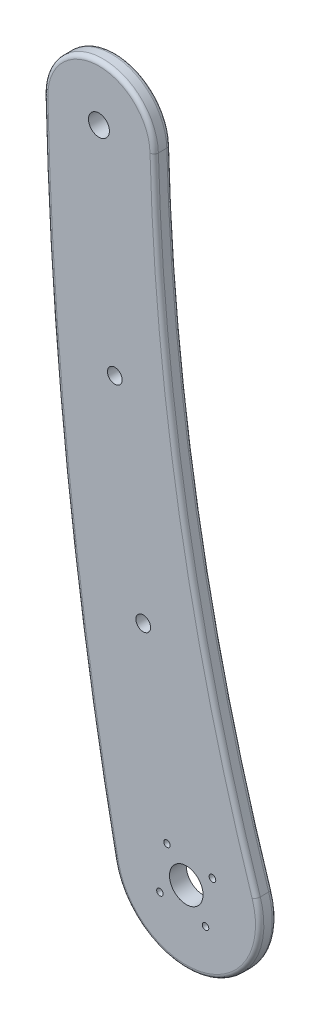
ISO-10303-21;
HEADER;
FILE_DESCRIPTION(('STEP AP214'),'2;1');
FILE_NAME('part.step','',(''),(''),'','','');
FILE_SCHEMA(('AUTOMOTIVE_DESIGN { 1 0 10303 214 1 1 1 1 }'));
ENDSEC;
DATA;
#1=APPLICATION_CONTEXT('core data for automotive mechanical design processes');
#2=APPLICATION_PROTOCOL_DEFINITION('international standard','automotive_design',2000,#1);
#3=PRODUCT_CONTEXT('',#1,'mechanical');
#4=PRODUCT('Part','Part','',(#3));
#5=PRODUCT_RELATED_PRODUCT_CATEGORY('part','',(#4));
#6=PRODUCT_DEFINITION_FORMATION('','',#4);
#7=PRODUCT_DEFINITION_CONTEXT('part definition',#1,'design');
#8=PRODUCT_DEFINITION('design','',#6,#7);
#9=PRODUCT_DEFINITION_SHAPE('','',#8);
#10=(LENGTH_UNIT() NAMED_UNIT(*) SI_UNIT(.MILLI.,.METRE.));
#11=(NAMED_UNIT(*) PLANE_ANGLE_UNIT() SI_UNIT($,.RADIAN.));
#12=(NAMED_UNIT(*) SI_UNIT($,.STERADIAN.) SOLID_ANGLE_UNIT());
#13=UNCERTAINTY_MEASURE_WITH_UNIT(LENGTH_MEASURE(1.E-05),#10,'distance_accuracy_value','');
#14=(GEOMETRIC_REPRESENTATION_CONTEXT(3) GLOBAL_UNCERTAINTY_ASSIGNED_CONTEXT((#13)) GLOBAL_UNIT_ASSIGNED_CONTEXT((#10,
#11,#12)) REPRESENTATION_CONTEXT('',''));
#15=CARTESIAN_POINT('',(0.,0.,0.));
#16=DIRECTION('',(0.,0.,1.));
#17=DIRECTION('',(1.,0.,0.));
#18=AXIS2_PLACEMENT_3D('',#15,#16,#17);
#19=CARTESIAN_POINT('',(795.529964386181,224.037291756772,2.));
#20=DIRECTION('',(0.,0.,-1.));
#21=DIRECTION('',(-1.,0.,0.));
#22=AXIS2_PLACEMENT_3D('',#19,#20,#21);
#23=CYLINDRICAL_SURFACE('',#22,850.);
#24=DIRECTION('',(0.,0.,-1.));
#25=VECTOR('',#24,1.);
#26=CARTESIAN_POINT('',(-54.2361172491982,204.097218987227,2.));
#27=LINE('',#26,#25);
#28=CARTESIAN_POINT('',(-54.2361172491982,204.097218987227,1.));
#29=VERTEX_POINT('',#28);
#30=CARTESIAN_POINT('',(-54.2361172491982,204.097218987227,-1.));
#31=VERTEX_POINT('',#30);
#32=EDGE_CURVE('E267',#29,#31,#27,.T.);
#33=ORIENTED_EDGE('',*,*,#32,.T.);
#34=CARTESIAN_POINT('',(795.529964386181,224.037291756772,-1.));
#35=DIRECTION('',(0.,0.,1.));
#36=DIRECTION('',(1.,0.,0.));
#37=AXIS2_PLACEMENT_3D('',#34,#35,#36);
#38=CIRCLE('',#37,850.);
#39=CARTESIAN_POINT('',(-37.367897149259,54.3872040771849,-1.));
#40=VERTEX_POINT('',#39);
#41=EDGE_CURVE('E140',#31,#40,#38,.T.);
#42=ORIENTED_EDGE('',*,*,#41,.T.);
#43=DIRECTION('',(0.,0.,-1.));
#44=VECTOR('',#43,1.);
#45=CARTESIAN_POINT('',(-37.367897149259,54.3872040771849,2.));
#46=LINE('',#45,#44);
#47=CARTESIAN_POINT('',(-37.367897149259,54.3872040771849,1.));
#48=VERTEX_POINT('',#47);
#49=EDGE_CURVE('E123',#48,#40,#46,.T.);
#50=ORIENTED_EDGE('',*,*,#49,.F.);
#51=CARTESIAN_POINT('',(795.529964386181,224.037291756772,1.));
#52=DIRECTION('',(0.,0.,1.));
#53=DIRECTION('',(1.,0.,0.));
#54=AXIS2_PLACEMENT_3D('',#51,#52,#53);
#55=CIRCLE('',#54,850.);
#56=EDGE_CURVE('E138',#48,#29,#55,.F.);
#57=ORIENTED_EDGE('',*,*,#56,.T.);
#58=EDGE_LOOP('',(#33,#42,#50,#57));
#59=FACE_BOUND('',#58,.T.);
#60=ADVANCED_FACE('F34',(#59),#23,.T.);
#61=CARTESIAN_POINT('',(-20.22,57.8800000000001,2.));
#62=DIRECTION('',(0.,0.,-1.));
#63=DIRECTION('',(-1.,0.,0.));
#64=AXIS2_PLACEMENT_3D('',#61,#62,#63);
#65=CYLINDRICAL_SURFACE('',#64,17.5);
#66=ORIENTED_EDGE('',*,*,#49,.T.);
#67=CARTESIAN_POINT('',(-20.22,57.8800000000001,-1.));
#68=DIRECTION('',(0.,0.,1.));
#69=DIRECTION('',(1.,0.,0.));
#70=AXIS2_PLACEMENT_3D('',#67,#68,#69);
#71=CIRCLE('',#70,17.5);
#72=CARTESIAN_POINT('',(-3.57614065730799,63.2866575793815,-1.));
#73=VERTEX_POINT('',#72);
#74=EDGE_CURVE('E144',#40,#73,#71,.T.);
#75=ORIENTED_EDGE('',*,*,#74,.T.);
#76=DIRECTION('',(0.,0.,-1.));
#77=VECTOR('',#76,1.);
#78=CARTESIAN_POINT('',(-3.57614065730799,63.2866575793815,2.));
#79=LINE('',#78,#77);
#80=CARTESIAN_POINT('',(-3.57614065730799,63.2866575793815,1.));
#81=VERTEX_POINT('',#80);
#82=EDGE_CURVE('E268',#81,#73,#79,.T.);
#83=ORIENTED_EDGE('',*,*,#82,.F.);
#84=CARTESIAN_POINT('',(-20.22,57.8800000000001,1.));
#85=DIRECTION('',(0.,0.,1.));
#86=DIRECTION('',(1.,0.,0.));
#87=AXIS2_PLACEMENT_3D('',#84,#85,#86);
#88=CIRCLE('',#87,17.5);
#89=EDGE_CURVE('E142',#81,#48,#88,.F.);
#90=ORIENTED_EDGE('',*,*,#89,.T.);
#91=EDGE_LOOP('',(#66,#75,#83,#90));
#92=FACE_BOUND('',#91,.T.);
#93=ADVANCED_FACE('F195',(#92),#65,.T.);
#94=CARTESIAN_POINT('',(471.962697705322,217.76258841885,2.));
#95=DIRECTION('',(0.,0.,-1.));
#96=DIRECTION('',(-1.,0.,0.));
#97=AXIS2_PLACEMENT_3D('',#94,#95,#96);
#98=CYLINDRICAL_SURFACE('',#97,500.);
#99=ORIENTED_EDGE('',*,*,#82,.T.);
#100=CARTESIAN_POINT('',(471.962697705322,217.76258841885,-1.));
#101=DIRECTION('',(0.,0.,1.));
#102=DIRECTION('',(1.,0.,0.));
#103=AXIS2_PLACEMENT_3D('',#100,#101,#102);
#104=CIRCLE('',#103,500.);
#105=CARTESIAN_POINT('',(-27.8679416368813,204.749826422866,-1.));
#106=VERTEX_POINT('',#105);
#107=EDGE_CURVE('E11',#73,#106,#104,.F.);
#108=ORIENTED_EDGE('',*,*,#107,.T.);
#109=DIRECTION('',(0.,0.,-1.));
#110=VECTOR('',#109,1.);
#111=CARTESIAN_POINT('',(-27.8679416368813,204.749826422866,2.));
#112=LINE('',#111,#110);
#113=CARTESIAN_POINT('',(-27.8679416368813,204.749826422866,1.));
#114=VERTEX_POINT('',#113);
#115=EDGE_CURVE('E266',#114,#106,#112,.T.);
#116=ORIENTED_EDGE('',*,*,#115,.F.);
#117=CARTESIAN_POINT('',(471.962697705322,217.76258841885,1.));
#118=DIRECTION('',(0.,0.,1.));
#119=DIRECTION('',(1.,0.,0.));
#120=AXIS2_PLACEMENT_3D('',#117,#118,#119);
#121=CIRCLE('',#120,500.);
#122=EDGE_CURVE('E43',#114,#81,#121,.T.);
#123=ORIENTED_EDGE('',*,*,#122,.T.);
#124=EDGE_LOOP('',(#99,#108,#116,#123));
#125=FACE_BOUND('',#124,.T.);
#126=ADVANCED_FACE('F201',(#125),#98,.F.);
#127=CARTESIAN_POINT('',(-20.22,57.88,2.));
#128=DIRECTION('',(0.,0.,-1.));
#129=DIRECTION('',(-1.,0.,0.));
#130=AXIS2_PLACEMENT_3D('',#127,#128,#129);
#131=CYLINDRICAL_SURFACE('',#130,4.);
#132=CARTESIAN_POINT('',(-20.22,57.88,2.));
#133=DIRECTION('',(0.,0.,1.));
#134=DIRECTION('',(1.,0.,0.));
#135=AXIS2_PLACEMENT_3D('',#132,#133,#134);
#136=CIRCLE('',#135,4.);
#137=CARTESIAN_POINT('',(-16.22,57.88,2.));
#138=VERTEX_POINT('',#137);
#139=EDGE_CURVE('E271',#138,#138,#136,.T.);
#140=ORIENTED_EDGE('',*,*,#139,.T.);
#141=EDGE_LOOP('',(#140));
#142=FACE_BOUND('',#141,.T.);
#143=CARTESIAN_POINT('',(-20.22,57.88,-2.));
#144=DIRECTION('',(0.,0.,1.));
#145=DIRECTION('',(1.,0.,0.));
#146=AXIS2_PLACEMENT_3D('',#143,#144,#145);
#147=CIRCLE('',#146,4.);
#148=CARTESIAN_POINT('',(-16.22,57.88,-2.));
#149=VERTEX_POINT('',#148);
#150=EDGE_CURVE('E280',#149,#149,#147,.T.);
#151=ORIENTED_EDGE('',*,*,#150,.F.);
#152=EDGE_LOOP('',(#151));
#153=FACE_BOUND('',#152,.T.);
#154=ADVANCED_FACE('F207',(#142,#153),#131,.F.);
#155=CARTESIAN_POINT('',(-30.482103358654,106.815562065397,2.));
#156=DIRECTION('',(0.,0.,-1.));
#157=DIRECTION('',(-1.,0.,0.));
#158=AXIS2_PLACEMENT_3D('',#155,#156,#157);
#159=CYLINDRICAL_SURFACE('',#158,1.75);
#160=CARTESIAN_POINT('',(-30.482103358654,106.815562065397,2.));
#161=DIRECTION('',(0.,0.,1.));
#162=DIRECTION('',(1.,0.,0.));
#163=AXIS2_PLACEMENT_3D('',#160,#161,#162);
#164=CIRCLE('',#163,1.75);
#165=CARTESIAN_POINT('',(-28.732103358654,106.815562065397,2.));
#166=VERTEX_POINT('',#165);
#167=EDGE_CURVE('E294',#166,#166,#164,.T.);
#168=ORIENTED_EDGE('',*,*,#167,.T.);
#169=EDGE_LOOP('',(#168));
#170=FACE_BOUND('',#169,.T.);
#171=CARTESIAN_POINT('',(-30.482103358654,106.815562065397,-2.));
#172=DIRECTION('',(0.,0.,1.));
#173=DIRECTION('',(1.,0.,0.));
#174=AXIS2_PLACEMENT_3D('',#171,#172,#173);
#175=CIRCLE('',#174,1.75);
#176=CARTESIAN_POINT('',(-28.732103358654,106.815562065397,-2.));
#177=VERTEX_POINT('',#176);
#178=EDGE_CURVE('E284',#177,#177,#175,.T.);
#179=ORIENTED_EDGE('',*,*,#178,.F.);
#180=EDGE_LOOP('',(#179));
#181=FACE_BOUND('',#180,.T.);
#182=ADVANCED_FACE('F210',(#170,#181),#159,.F.);
#183=CARTESIAN_POINT('',(-41.0516105664775,204.406598272145,2.));
#184=DIRECTION('',(0.,0.,-1.));
#185=DIRECTION('',(-1.,0.,0.));
#186=AXIS2_PLACEMENT_3D('',#183,#184,#185);
#187=CYLINDRICAL_SURFACE('',#186,2.5);
#188=CARTESIAN_POINT('',(-41.0516105664775,204.406598272145,2.));
#189=DIRECTION('',(0.,0.,1.));
#190=DIRECTION('',(1.,0.,0.));
#191=AXIS2_PLACEMENT_3D('',#188,#189,#190);
#192=CIRCLE('',#191,2.5);
#193=CARTESIAN_POINT('',(-38.5516105664775,204.406598272145,2.));
#194=VERTEX_POINT('',#193);
#195=EDGE_CURVE('E297',#194,#194,#192,.T.);
#196=ORIENTED_EDGE('',*,*,#195,.T.);
#197=EDGE_LOOP('',(#196));
#198=FACE_BOUND('',#197,.T.);
#199=CARTESIAN_POINT('',(-41.0516105664775,204.406598272145,-2.));
#200=DIRECTION('',(0.,0.,1.));
#201=DIRECTION('',(1.,0.,0.));
#202=AXIS2_PLACEMENT_3D('',#199,#200,#201);
#203=CIRCLE('',#202,2.5);
#204=CARTESIAN_POINT('',(-38.5516105664775,204.406598272145,-2.));
#205=VERTEX_POINT('',#204);
#206=EDGE_CURVE('E287',#205,#205,#203,.T.);
#207=ORIENTED_EDGE('',*,*,#206,.F.);
#208=EDGE_LOOP('',(#207));
#209=FACE_BOUND('',#208,.T.);
#210=ADVANCED_FACE('F214',(#198,#209),#187,.F.);
#211=CARTESIAN_POINT('',(-37.2684730070745,154.549924995575,2.));
#212=DIRECTION('',(0.,0.,-1.));
#213=DIRECTION('',(-1.,0.,0.));
#214=AXIS2_PLACEMENT_3D('',#211,#212,#213);
#215=CYLINDRICAL_SURFACE('',#214,1.75);
#216=CARTESIAN_POINT('',(-37.2684730070745,154.549924995575,2.));
#217=DIRECTION('',(0.,0.,1.));
#218=DIRECTION('',(1.,0.,0.));
#219=AXIS2_PLACEMENT_3D('',#216,#217,#218);
#220=CIRCLE('',#219,1.75);
#221=CARTESIAN_POINT('',(-35.5184730070745,154.549924995575,2.));
#222=VERTEX_POINT('',#221);
#223=EDGE_CURVE('E283',#222,#222,#220,.T.);
#224=ORIENTED_EDGE('',*,*,#223,.T.);
#225=EDGE_LOOP('',(#224));
#226=FACE_BOUND('',#225,.T.);
#227=CARTESIAN_POINT('',(-37.2684730070745,154.549924995575,-2.));
#228=DIRECTION('',(0.,0.,1.));
#229=DIRECTION('',(1.,0.,0.));
#230=AXIS2_PLACEMENT_3D('',#227,#228,#229);
#231=CIRCLE('',#230,1.75);
#232=CARTESIAN_POINT('',(-35.5184730070745,154.549924995575,-2.));
#233=VERTEX_POINT('',#232);
#234=EDGE_CURVE('E159',#233,#233,#231,.T.);
#235=ORIENTED_EDGE('',*,*,#234,.F.);
#236=EDGE_LOOP('',(#235));
#237=FACE_BOUND('',#236,.T.);
#238=ADVANCED_FACE('F218',(#226,#237),#215,.F.);
#239=CARTESIAN_POINT('',(-41.0516105664774,204.406598272145,2.));
#240=DIRECTION('',(0.,0.,-1.));
#241=DIRECTION('',(-1.,0.,0.));
#242=AXIS2_PLACEMENT_3D('',#239,#240,#241);
#243=CYLINDRICAL_SURFACE('',#242,13.1881360323832);
#244=ORIENTED_EDGE('',*,*,#115,.T.);
#245=CARTESIAN_POINT('',(-41.0516105664774,204.406598272145,-1.));
#246=DIRECTION('',(0.,0.,1.));
#247=DIRECTION('',(1.,0.,0.));
#248=AXIS2_PLACEMENT_3D('',#245,#246,#247);
#249=CIRCLE('',#248,13.1881360323832);
#250=EDGE_CURVE('E109',#106,#31,#249,.T.);
#251=ORIENTED_EDGE('',*,*,#250,.T.);
#252=ORIENTED_EDGE('',*,*,#32,.F.);
#253=CARTESIAN_POINT('',(-41.0516105664774,204.406598272145,1.));
#254=DIRECTION('',(0.,0.,1.));
#255=DIRECTION('',(1.,0.,0.));
#256=AXIS2_PLACEMENT_3D('',#253,#254,#255);
#257=CIRCLE('',#256,13.1881360323832);
#258=EDGE_CURVE('E130',#29,#114,#257,.F.);
#259=ORIENTED_EDGE('',*,*,#258,.T.);
#260=EDGE_LOOP('',(#244,#251,#252,#259));
#261=FACE_BOUND('',#260,.T.);
#262=ADVANCED_FACE('F222',(#261),#243,.T.);
#263=CARTESIAN_POINT('',(0.,0.,2.));
#264=DIRECTION('',(0.,0.,1.));
#265=DIRECTION('',(1.,0.,0.));
#266=AXIS2_PLACEMENT_3D('',#263,#264,#265);
#267=PLANE('',#266);
#268=CARTESIAN_POINT('',(-24.8144808396243,64.1519324898418,2.));
#269=DIRECTION('',(0.,0.,-1.));
#270=DIRECTION('',(-1.,0.,0.));
#271=AXIS2_PLACEMENT_3D('',#268,#269,#270);
#272=CIRCLE('',#271,0.767868533244551);
#273=CARTESIAN_POINT('',(-25.5823493728689,64.1519324898418,2.));
#274=VERTEX_POINT('',#273);
#275=EDGE_CURVE('E172',#274,#274,#272,.T.);
#276=ORIENTED_EDGE('',*,*,#275,.T.);
#277=EDGE_LOOP('',(#276));
#278=FACE_BOUND('',#277,.T.);
#279=CARTESIAN_POINT('',(-26.5151891655994,53.2992564984726,2.));
#280=DIRECTION('',(0.,0.,-1.));
#281=DIRECTION('',(-1.,0.,0.));
#282=AXIS2_PLACEMENT_3D('',#279,#280,#281);
#283=CIRCLE('',#282,0.771761199024674);
#284=CARTESIAN_POINT('',(-27.2869503646241,53.2992564984726,2.));
#285=VERTEX_POINT('',#284);
#286=EDGE_CURVE('E308',#285,#285,#283,.T.);
#287=ORIENTED_EDGE('',*,*,#286,.T.);
#288=EDGE_LOOP('',(#287));
#289=FACE_BOUND('',#288,.T.);
#290=CARTESIAN_POINT('',(-15.627794634822,51.6358969960497,2.));
#291=DIRECTION('',(0.,0.,-1.));
#292=DIRECTION('',(-1.,0.,0.));
#293=AXIS2_PLACEMENT_3D('',#290,#291,#292);
#294=CIRCLE('',#293,0.768034617716511);
#295=CARTESIAN_POINT('',(-16.3958292525385,51.6358969960497,2.));
#296=VERTEX_POINT('',#295);
#297=EDGE_CURVE('E305',#296,#296,#294,.T.);
#298=ORIENTED_EDGE('',*,*,#297,.T.);
#299=EDGE_LOOP('',(#298));
#300=FACE_BOUND('',#299,.T.);
#301=CARTESIAN_POINT('',(-13.9848420209366,62.4261721582919,2.));
#302=DIRECTION('',(0.,0.,-1.));
#303=DIRECTION('',(-1.,0.,0.));
#304=AXIS2_PLACEMENT_3D('',#301,#302,#303);
#305=CIRCLE('',#304,0.795284138011949);
#306=CARTESIAN_POINT('',(-14.7801261589485,62.4261721582919,2.));
#307=VERTEX_POINT('',#306);
#308=EDGE_CURVE('E302',#307,#307,#305,.T.);
#309=ORIENTED_EDGE('',*,*,#308,.T.);
#310=EDGE_LOOP('',(#309));
#311=FACE_BOUND('',#310,.T.);
#312=CARTESIAN_POINT('',(471.962697705322,217.76258841885,2.));
#313=DIRECTION('',(0.,0.,1.));
#314=DIRECTION('',(1.,0.,0.));
#315=AXIS2_PLACEMENT_3D('',#312,#313,#314);
#316=CIRCLE('',#315,501.);
#317=CARTESIAN_POINT('',(-4.52721833403318,62.9777057177026,2.));
#318=VERTEX_POINT('',#317);
#319=CARTESIAN_POINT('',(-28.8676029155657,204.723800898874,2.));
#320=VERTEX_POINT('',#319);
#321=EDGE_CURVE('E146',#318,#320,#316,.F.);
#322=ORIENTED_EDGE('',*,*,#321,.T.);
#323=CARTESIAN_POINT('',(-41.0516105664774,204.406598272145,2.));
#324=DIRECTION('',(0.,0.,1.));
#325=DIRECTION('',(1.,0.,0.));
#326=AXIS2_PLACEMENT_3D('',#323,#324,#325);
#327=CIRCLE('',#326,12.1881360323832);
#328=CARTESIAN_POINT('',(-53.2363924472743,204.120677896368,2.));
#329=VERTEX_POINT('',#328);
#330=EDGE_CURVE('E151',#320,#329,#327,.T.);
#331=ORIENTED_EDGE('',*,*,#330,.T.);
#332=CARTESIAN_POINT('',(795.529964386181,224.037291756772,2.));
#333=DIRECTION('',(0.,0.,1.));
#334=DIRECTION('',(1.,0.,0.));
#335=AXIS2_PLACEMENT_3D('',#332,#333,#334);
#336=CIRCLE('',#335,849.);
#337=CARTESIAN_POINT('',(-36.3880173121585,54.5867924156315,2.));
#338=VERTEX_POINT('',#337);
#339=EDGE_CURVE('E58',#329,#338,#336,.T.);
#340=ORIENTED_EDGE('',*,*,#339,.T.);
#341=CARTESIAN_POINT('',(-20.22,57.8800000000001,2.));
#342=DIRECTION('',(0.,0.,1.));
#343=DIRECTION('',(1.,0.,0.));
#344=AXIS2_PLACEMENT_3D('',#341,#342,#343);
#345=CIRCLE('',#344,16.5);
#346=EDGE_CURVE('E148',#338,#318,#345,.T.);
#347=ORIENTED_EDGE('',*,*,#346,.T.);
#348=EDGE_LOOP('',(#322,#331,#340,#347));
#349=FACE_BOUND('',#348,.T.);
#350=ORIENTED_EDGE('',*,*,#223,.F.);
#351=EDGE_LOOP('',(#350));
#352=FACE_BOUND('',#351,.T.);
#353=ORIENTED_EDGE('',*,*,#195,.F.);
#354=EDGE_LOOP('',(#353));
#355=FACE_BOUND('',#354,.T.);
#356=ORIENTED_EDGE('',*,*,#167,.F.);
#357=EDGE_LOOP('',(#356));
#358=FACE_BOUND('',#357,.T.);
#359=ORIENTED_EDGE('',*,*,#139,.F.);
#360=EDGE_LOOP('',(#359));
#361=FACE_BOUND('',#360,.T.);
#362=ADVANCED_FACE('F255',(#278,#289,#300,#311,#349,#352,#355,#358,#361),#267,.T.);
#363=CARTESIAN_POINT('',(0.,0.,-2.));
#364=DIRECTION('',(0.,0.,1.));
#365=DIRECTION('',(1.,0.,0.));
#366=AXIS2_PLACEMENT_3D('',#363,#364,#365);
#367=PLANE('',#366);
#368=CARTESIAN_POINT('',(-24.8144808396243,64.1519324898418,-2.));
#369=DIRECTION('',(0.,0.,1.));
#370=DIRECTION('',(1.,0.,0.));
#371=AXIS2_PLACEMENT_3D('',#368,#369,#370);
#372=CIRCLE('',#371,0.767868533244551);
#373=CARTESIAN_POINT('',(-24.0466123063798,64.1519324898418,-2.));
#374=VERTEX_POINT('',#373);
#375=EDGE_CURVE('E38',#374,#374,#372,.T.);
#376=ORIENTED_EDGE('',*,*,#375,.T.);
#377=EDGE_LOOP('',(#376));
#378=FACE_BOUND('',#377,.T.);
#379=CARTESIAN_POINT('',(-26.5151891655994,53.2992564984726,-2.));
#380=DIRECTION('',(0.,0.,1.));
#381=DIRECTION('',(1.,0.,0.));
#382=AXIS2_PLACEMENT_3D('',#379,#380,#381);
#383=CIRCLE('',#382,0.771761199024674);
#384=CARTESIAN_POINT('',(-25.7434279665748,53.2992564984726,-2.));
#385=VERTEX_POINT('',#384);
#386=EDGE_CURVE('E174',#385,#385,#383,.T.);
#387=ORIENTED_EDGE('',*,*,#386,.T.);
#388=EDGE_LOOP('',(#387));
#389=FACE_BOUND('',#388,.T.);
#390=CARTESIAN_POINT('',(-15.627794634822,51.6358969960497,-2.));
#391=DIRECTION('',(0.,0.,1.));
#392=DIRECTION('',(1.,0.,0.));
#393=AXIS2_PLACEMENT_3D('',#390,#391,#392);
#394=CIRCLE('',#393,0.768034617716511);
#395=CARTESIAN_POINT('',(-14.8597600171054,51.6358969960497,-2.));
#396=VERTEX_POINT('',#395);
#397=EDGE_CURVE('E171',#396,#396,#394,.T.);
#398=ORIENTED_EDGE('',*,*,#397,.T.);
#399=EDGE_LOOP('',(#398));
#400=FACE_BOUND('',#399,.T.);
#401=CARTESIAN_POINT('',(-13.9848420209366,62.4261721582919,-2.));
#402=DIRECTION('',(0.,0.,1.));
#403=DIRECTION('',(1.,0.,0.));
#404=AXIS2_PLACEMENT_3D('',#401,#402,#403);
#405=CIRCLE('',#404,0.795284138011949);
#406=CARTESIAN_POINT('',(-13.1895578829246,62.4261721582919,-2.));
#407=VERTEX_POINT('',#406);
#408=EDGE_CURVE('E168',#407,#407,#405,.T.);
#409=ORIENTED_EDGE('',*,*,#408,.T.);
#410=EDGE_LOOP('',(#409));
#411=FACE_BOUND('',#410,.T.);
#412=CARTESIAN_POINT('',(795.529964386181,224.037291756772,-2.));
#413=DIRECTION('',(0.,0.,1.));
#414=DIRECTION('',(1.,0.,0.));
#415=AXIS2_PLACEMENT_3D('',#412,#413,#414);
#416=CIRCLE('',#415,849.);
#417=CARTESIAN_POINT('',(-36.3880173121585,54.5867924156315,-2.));
#418=VERTEX_POINT('',#417);
#419=CARTESIAN_POINT('',(-53.2363924472743,204.120677896368,-2.));
#420=VERTEX_POINT('',#419);
#421=EDGE_CURVE('E128',#418,#420,#416,.F.);
#422=ORIENTED_EDGE('',*,*,#421,.T.);
#423=CARTESIAN_POINT('',(-41.0516105664774,204.406598272145,-2.));
#424=DIRECTION('',(0.,0.,1.));
#425=DIRECTION('',(1.,0.,0.));
#426=AXIS2_PLACEMENT_3D('',#423,#424,#425);
#427=CIRCLE('',#426,12.1881360323832);
#428=CARTESIAN_POINT('',(-28.8676029155657,204.723800898874,-2.));
#429=VERTEX_POINT('',#428);
#430=EDGE_CURVE('E107',#420,#429,#427,.F.);
#431=ORIENTED_EDGE('',*,*,#430,.T.);
#432=CARTESIAN_POINT('',(471.962697705322,217.76258841885,-2.));
#433=DIRECTION('',(0.,0.,1.));
#434=DIRECTION('',(1.,0.,0.));
#435=AXIS2_PLACEMENT_3D('',#432,#433,#434);
#436=CIRCLE('',#435,501.);
#437=CARTESIAN_POINT('',(-4.52721833403318,62.9777057177026,-2.));
#438=VERTEX_POINT('',#437);
#439=EDGE_CURVE('E116',#429,#438,#436,.T.);
#440=ORIENTED_EDGE('',*,*,#439,.T.);
#441=CARTESIAN_POINT('',(-20.22,57.8800000000001,-2.));
#442=DIRECTION('',(0.,0.,1.));
#443=DIRECTION('',(1.,0.,0.));
#444=AXIS2_PLACEMENT_3D('',#441,#442,#443);
#445=CIRCLE('',#444,16.5);
#446=EDGE_CURVE('E122',#438,#418,#445,.F.);
#447=ORIENTED_EDGE('',*,*,#446,.T.);
#448=EDGE_LOOP('',(#422,#431,#440,#447));
#449=FACE_BOUND('',#448,.T.);
#450=ORIENTED_EDGE('',*,*,#234,.T.);
#451=EDGE_LOOP('',(#450));
#452=FACE_BOUND('',#451,.T.);
#453=ORIENTED_EDGE('',*,*,#206,.T.);
#454=EDGE_LOOP('',(#453));
#455=FACE_BOUND('',#454,.T.);
#456=ORIENTED_EDGE('',*,*,#178,.T.);
#457=EDGE_LOOP('',(#456));
#458=FACE_BOUND('',#457,.T.);
#459=ORIENTED_EDGE('',*,*,#150,.T.);
#460=EDGE_LOOP('',(#459));
#461=FACE_BOUND('',#460,.T.);
#462=ADVANCED_FACE('F125',(#378,#389,#400,#411,#449,#452,#455,#458,#461),#367,.F.);
#463=CARTESIAN_POINT('',(-20.22,57.8800000000001,-1.));
#464=DIRECTION('',(0.,0.,1.));
#465=DIRECTION('',(1.,0.,0.));
#466=AXIS2_PLACEMENT_3D('',#463,#464,#465);
#467=TOROIDAL_SURFACE('',#466,16.5,1.);
#468=CARTESIAN_POINT('',(-4.52721833403318,62.9777057177026,-1.));
#469=DIRECTION('',(-0.308951861678939,0.95107767672526,0.));
#470=DIRECTION('',(-0.95107767672526,-0.308951861678939,0.));
#471=AXIS2_PLACEMENT_3D('',#468,#469,#470);
#472=CIRCLE('',#471,1.);
#473=EDGE_CURVE('E119',#73,#438,#472,.T.);
#474=ORIENTED_EDGE('',*,*,#473,.F.);
#475=ORIENTED_EDGE('',*,*,#74,.F.);
#476=CARTESIAN_POINT('',(-36.3880173121585,54.5867924156315,-1.));
#477=DIRECTION('',(-0.199588338446577,0.979879837100517,0.));
#478=DIRECTION('',(-0.979879837100517,-0.199588338446577,0.));
#479=AXIS2_PLACEMENT_3D('',#476,#477,#478);
#480=CIRCLE('',#479,1.);
#481=EDGE_CURVE('E156',#418,#40,#480,.T.);
#482=ORIENTED_EDGE('',*,*,#481,.F.);
#483=ORIENTED_EDGE('',*,*,#446,.F.);
#484=EDGE_LOOP('',(#474,#475,#482,#483));
#485=FACE_BOUND('',#484,.T.);
#486=ADVANCED_FACE('F231',(#485),#467,.T.);
#487=CARTESIAN_POINT('',(795.529964386181,224.037291756772,-1.));
#488=DIRECTION('',(0.,0.,1.));
#489=DIRECTION('',(1.,0.,0.));
#490=AXIS2_PLACEMENT_3D('',#487,#488,#489);
#491=TOROIDAL_SURFACE('',#490,849.,1.);
#492=ORIENTED_EDGE('',*,*,#481,.T.);
#493=ORIENTED_EDGE('',*,*,#41,.F.);
#494=CARTESIAN_POINT('',(-53.2363924472743,204.120677896368,-1.));
#495=DIRECTION('',(-0.0234589091406304,0.999724801923975,0.));
#496=DIRECTION('',(-0.999724801923975,-0.0234589091406304,0.));
#497=AXIS2_PLACEMENT_3D('',#494,#495,#496);
#498=CIRCLE('',#497,1.);
#499=EDGE_CURVE('E112',#420,#31,#498,.T.);
#500=ORIENTED_EDGE('',*,*,#499,.F.);
#501=ORIENTED_EDGE('',*,*,#421,.F.);
#502=EDGE_LOOP('',(#492,#493,#500,#501));
#503=FACE_BOUND('',#502,.T.);
#504=ADVANCED_FACE('F228',(#503),#491,.T.);
#505=CARTESIAN_POINT('',(471.962697705322,217.76258841885,-1.));
#506=DIRECTION('',(0.,0.,1.));
#507=DIRECTION('',(1.,0.,0.));
#508=AXIS2_PLACEMENT_3D('',#505,#506,#507);
#509=TOROIDAL_SURFACE('',#508,501.,1.);
#510=ORIENTED_EDGE('',*,*,#473,.T.);
#511=ORIENTED_EDGE('',*,*,#439,.F.);
#512=CARTESIAN_POINT('',(-28.8676029155658,204.723800898874,-1.));
#513=DIRECTION('',(-0.0260255239919737,0.999661278684407,0.));
#514=DIRECTION('',(-0.999661278684407,-0.0260255239919738,0.));
#515=AXIS2_PLACEMENT_3D('',#512,#513,#514);
#516=CIRCLE('',#515,1.);
#517=EDGE_CURVE('E103',#106,#429,#516,.T.);
#518=ORIENTED_EDGE('',*,*,#517,.F.);
#519=ORIENTED_EDGE('',*,*,#107,.F.);
#520=EDGE_LOOP('',(#510,#511,#518,#519));
#521=FACE_BOUND('',#520,.T.);
#522=ADVANCED_FACE('F117',(#521),#509,.T.);
#523=CARTESIAN_POINT('',(-41.0516105664774,204.406598272145,-1.));
#524=DIRECTION('',(0.,0.,1.));
#525=DIRECTION('',(1.,0.,0.));
#526=AXIS2_PLACEMENT_3D('',#523,#524,#525);
#527=TOROIDAL_SURFACE('',#526,12.1881360323832,1.);
#528=ORIENTED_EDGE('',*,*,#499,.T.);
#529=ORIENTED_EDGE('',*,*,#250,.F.);
#530=ORIENTED_EDGE('',*,*,#517,.T.);
#531=ORIENTED_EDGE('',*,*,#430,.F.);
#532=EDGE_LOOP('',(#528,#529,#530,#531));
#533=FACE_BOUND('',#532,.T.);
#534=ADVANCED_FACE('F105',(#533),#527,.T.);
#535=CARTESIAN_POINT('',(-20.22,57.8800000000001,1.));
#536=DIRECTION('',(0.,0.,1.));
#537=DIRECTION('',(1.,0.,0.));
#538=AXIS2_PLACEMENT_3D('',#535,#536,#537);
#539=TOROIDAL_SURFACE('',#538,16.5,1.);
#540=CARTESIAN_POINT('',(-4.52721833403318,62.9777057177026,1.));
#541=DIRECTION('',(-0.308951861678939,0.95107767672526,0.));
#542=DIRECTION('',(-0.95107767672526,-0.308951861678939,0.));
#543=AXIS2_PLACEMENT_3D('',#540,#541,#542);
#544=CIRCLE('',#543,1.);
#545=EDGE_CURVE('E163',#318,#81,#544,.T.);
#546=ORIENTED_EDGE('',*,*,#545,.F.);
#547=ORIENTED_EDGE('',*,*,#346,.F.);
#548=CARTESIAN_POINT('',(-36.3880173121585,54.5867924156315,1.));
#549=DIRECTION('',(-0.199588338446583,0.979879837100515,0.));
#550=DIRECTION('',(-0.979879837100515,-0.199588338446583,0.));
#551=AXIS2_PLACEMENT_3D('',#548,#549,#550);
#552=CIRCLE('',#551,1.);
#553=EDGE_CURVE('E113',#48,#338,#552,.T.);
#554=ORIENTED_EDGE('',*,*,#553,.F.);
#555=ORIENTED_EDGE('',*,*,#89,.F.);
#556=EDGE_LOOP('',(#546,#547,#554,#555));
#557=FACE_BOUND('',#556,.T.);
#558=ADVANCED_FACE('F36',(#557),#539,.T.);
#559=CARTESIAN_POINT('',(795.529964386181,224.037291756772,1.));
#560=DIRECTION('',(0.,0.,1.));
#561=DIRECTION('',(1.,0.,0.));
#562=AXIS2_PLACEMENT_3D('',#559,#560,#561);
#563=TOROIDAL_SURFACE('',#562,849.,1.);
#564=ORIENTED_EDGE('',*,*,#553,.T.);
#565=ORIENTED_EDGE('',*,*,#339,.F.);
#566=CARTESIAN_POINT('',(-53.2363924472742,204.120677896368,1.));
#567=DIRECTION('',(-0.0234589091406279,0.999724801923975,0.));
#568=DIRECTION('',(-0.999724801923975,-0.0234589091406279,0.));
#569=AXIS2_PLACEMENT_3D('',#566,#567,#568);
#570=CIRCLE('',#569,1.);
#571=EDGE_CURVE('E51',#29,#329,#570,.T.);
#572=ORIENTED_EDGE('',*,*,#571,.F.);
#573=ORIENTED_EDGE('',*,*,#56,.F.);
#574=EDGE_LOOP('',(#564,#565,#572,#573));
#575=FACE_BOUND('',#574,.T.);
#576=ADVANCED_FACE('F242',(#575),#563,.T.);
#577=CARTESIAN_POINT('',(471.962697705322,217.76258841885,1.));
#578=DIRECTION('',(0.,0.,1.));
#579=DIRECTION('',(1.,0.,0.));
#580=AXIS2_PLACEMENT_3D('',#577,#578,#579);
#581=TOROIDAL_SURFACE('',#580,501.,1.);
#582=ORIENTED_EDGE('',*,*,#545,.T.);
#583=ORIENTED_EDGE('',*,*,#122,.F.);
#584=CARTESIAN_POINT('',(-28.8676029155657,204.723800898874,1.));
#585=DIRECTION('',(-0.0260255239919766,0.999661278684407,0.));
#586=DIRECTION('',(-0.999661278684407,-0.0260255239919766,0.));
#587=AXIS2_PLACEMENT_3D('',#584,#585,#586);
#588=CIRCLE('',#587,1.);
#589=EDGE_CURVE('E160',#320,#114,#588,.T.);
#590=ORIENTED_EDGE('',*,*,#589,.F.);
#591=ORIENTED_EDGE('',*,*,#321,.F.);
#592=EDGE_LOOP('',(#582,#583,#590,#591));
#593=FACE_BOUND('',#592,.T.);
#594=ADVANCED_FACE('F240',(#593),#581,.T.);
#595=CARTESIAN_POINT('',(-41.0516105664774,204.406598272145,1.));
#596=DIRECTION('',(0.,0.,1.));
#597=DIRECTION('',(1.,0.,0.));
#598=AXIS2_PLACEMENT_3D('',#595,#596,#597);
#599=TOROIDAL_SURFACE('',#598,12.1881360323832,1.);
#600=ORIENTED_EDGE('',*,*,#571,.T.);
#601=ORIENTED_EDGE('',*,*,#330,.F.);
#602=ORIENTED_EDGE('',*,*,#589,.T.);
#603=ORIENTED_EDGE('',*,*,#258,.F.);
#604=EDGE_LOOP('',(#600,#601,#602,#603));
#605=FACE_BOUND('',#604,.T.);
#606=ADVANCED_FACE('F236',(#605),#599,.T.);
#607=CARTESIAN_POINT('',(-13.9848420209366,62.4261721582919,2.));
#608=DIRECTION('',(0.,0.,-1.));
#609=DIRECTION('',(-1.,0.,0.));
#610=AXIS2_PLACEMENT_3D('',#607,#608,#609);
#611=CYLINDRICAL_SURFACE('',#610,0.795284138011949);
#612=ORIENTED_EDGE('',*,*,#308,.F.);
#613=EDGE_LOOP('',(#612));
#614=FACE_BOUND('',#613,.T.);
#615=ORIENTED_EDGE('',*,*,#408,.F.);
#616=EDGE_LOOP('',(#615));
#617=FACE_BOUND('',#616,.T.);
#618=ADVANCED_FACE('F239',(#614,#617),#611,.F.);
#619=CARTESIAN_POINT('',(-15.627794634822,51.6358969960497,2.));
#620=DIRECTION('',(0.,0.,-1.));
#621=DIRECTION('',(-1.,0.,0.));
#622=AXIS2_PLACEMENT_3D('',#619,#620,#621);
#623=CYLINDRICAL_SURFACE('',#622,0.768034617716511);
#624=ORIENTED_EDGE('',*,*,#297,.F.);
#625=EDGE_LOOP('',(#624));
#626=FACE_BOUND('',#625,.T.);
#627=ORIENTED_EDGE('',*,*,#397,.F.);
#628=EDGE_LOOP('',(#627));
#629=FACE_BOUND('',#628,.T.);
#630=ADVANCED_FACE('F190',(#626,#629),#623,.F.);
#631=CARTESIAN_POINT('',(-26.5151891655994,53.2992564984726,2.));
#632=DIRECTION('',(0.,0.,-1.));
#633=DIRECTION('',(-1.,0.,0.));
#634=AXIS2_PLACEMENT_3D('',#631,#632,#633);
#635=CYLINDRICAL_SURFACE('',#634,0.771761199024674);
#636=ORIENTED_EDGE('',*,*,#286,.F.);
#637=EDGE_LOOP('',(#636));
#638=FACE_BOUND('',#637,.T.);
#639=ORIENTED_EDGE('',*,*,#386,.F.);
#640=EDGE_LOOP('',(#639));
#641=FACE_BOUND('',#640,.T.);
#642=ADVANCED_FACE('F184',(#638,#641),#635,.F.);
#643=CARTESIAN_POINT('',(-24.8144808396243,64.1519324898418,2.));
#644=DIRECTION('',(0.,0.,-1.));
#645=DIRECTION('',(-1.,0.,0.));
#646=AXIS2_PLACEMENT_3D('',#643,#644,#645);
#647=CYLINDRICAL_SURFACE('',#646,0.767868533244551);
#648=ORIENTED_EDGE('',*,*,#275,.F.);
#649=EDGE_LOOP('',(#648));
#650=FACE_BOUND('',#649,.T.);
#651=ORIENTED_EDGE('',*,*,#375,.F.);
#652=EDGE_LOOP('',(#651));
#653=FACE_BOUND('',#652,.T.);
#654=ADVANCED_FACE('F182',(#650,#653),#647,.F.);
#655=CLOSED_SHELL('',(#60,#93,#126,#154,#182,#210,#238,#262,#362,#462,#486,#504,#522,#534,#558,
#576,#594,#606,#618,#630,#642,#654));
#656=MANIFOLD_SOLID_BREP('B2',#655);
#657=ADVANCED_BREP_SHAPE_REPRESENTATION('',(#18,#656),#14);
#658=SHAPE_DEFINITION_REPRESENTATION(#9,#657);
ENDSEC;
END-ISO-10303-21;
